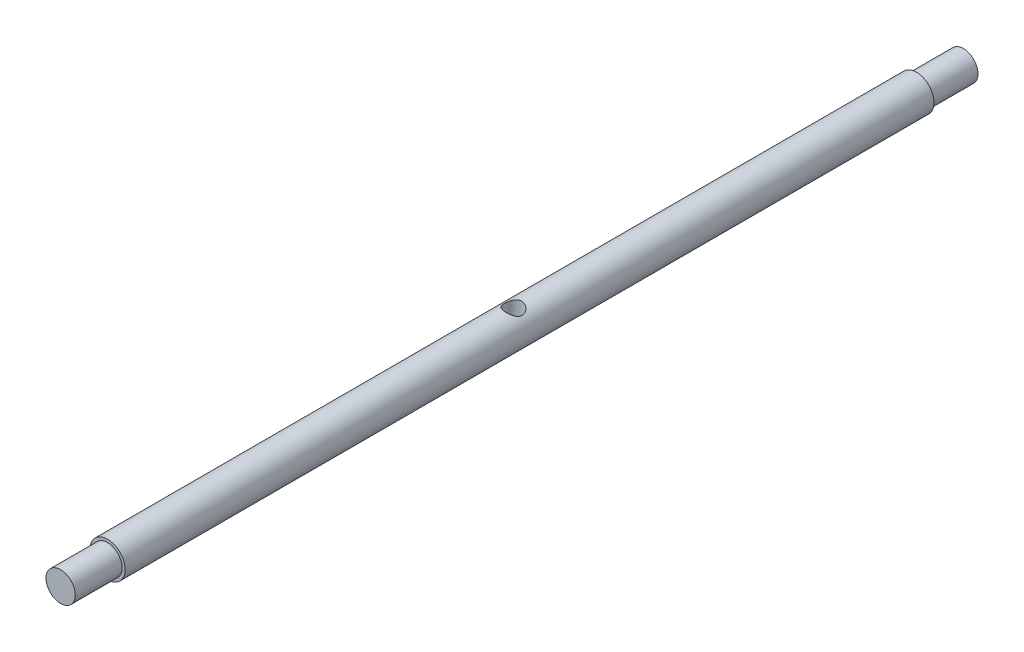
ISO-10303-21;
HEADER;
FILE_DESCRIPTION(('STEP AP214'),'2;1');
FILE_NAME('part.step','',(''),(''),'','','');
FILE_SCHEMA(('AUTOMOTIVE_DESIGN { 1 0 10303 214 1 1 1 1 }'));
ENDSEC;
DATA;
#1=APPLICATION_CONTEXT('core data for automotive mechanical design processes');
#2=APPLICATION_PROTOCOL_DEFINITION('international standard','automotive_design',2000,#1);
#3=PRODUCT_CONTEXT('',#1,'mechanical');
#4=PRODUCT('Part','Part','',(#3));
#5=PRODUCT_RELATED_PRODUCT_CATEGORY('part','',(#4));
#6=PRODUCT_DEFINITION_FORMATION('','',#4);
#7=PRODUCT_DEFINITION_CONTEXT('part definition',#1,'design');
#8=PRODUCT_DEFINITION('design','',#6,#7);
#9=PRODUCT_DEFINITION_SHAPE('','',#8);
#10=(LENGTH_UNIT() NAMED_UNIT(*) SI_UNIT(.MILLI.,.METRE.));
#11=(NAMED_UNIT(*) PLANE_ANGLE_UNIT() SI_UNIT($,.RADIAN.));
#12=(NAMED_UNIT(*) SI_UNIT($,.STERADIAN.) SOLID_ANGLE_UNIT());
#13=UNCERTAINTY_MEASURE_WITH_UNIT(LENGTH_MEASURE(1.E-05),#10,'distance_accuracy_value','');
#14=(GEOMETRIC_REPRESENTATION_CONTEXT(3) GLOBAL_UNCERTAINTY_ASSIGNED_CONTEXT((#13)) GLOBAL_UNIT_ASSIGNED_CONTEXT((#10,
#11,#12)) REPRESENTATION_CONTEXT('',''));
#15=CARTESIAN_POINT('',(0.,0.,0.));
#16=DIRECTION('',(0.,0.,1.));
#17=DIRECTION('',(1.,0.,0.));
#18=AXIS2_PLACEMENT_3D('',#15,#16,#17);
#19=CARTESIAN_POINT('',(0.,0.,138.));
#20=DIRECTION('',(0.,0.,-1.));
#21=DIRECTION('',(-1.,0.,0.));
#22=AXIS2_PLACEMENT_3D('',#19,#20,#21);
#23=CYLINDRICAL_SURFACE('',#22,3.);
#24=CARTESIAN_POINT('',(0.250000000000001,-2.98956518577535,70.5));
#25=CARTESIAN_POINT('',(0.172696421416141,-2.99602553013006,70.4999952113587));
#26=CARTESIAN_POINT('',(0.0950608738628828,-2.99947183506212,70.4939911977629));
#27=CARTESIAN_POINT('',(-0.0584400000249373,-3.00041641133484,70.4700060739507));
#28=CARTESIAN_POINT('',(-0.134302599700458,-2.99790606090529,70.4520076298905));
#29=CARTESIAN_POINT('',(-0.281790664814006,-2.98764875279408,70.4046990716207));
#30=CARTESIAN_POINT('',(-0.353427249171919,-2.9799162704619,70.37542032166));
#31=CARTESIAN_POINT('',(-0.49089667125681,-2.96037977583642,70.3065180067073));
#32=CARTESIAN_POINT('',(-0.556729410100019,-2.94857569418956,70.2668942655069));
#33=CARTESIAN_POINT('',(-0.68390290566241,-2.92175981715249,70.1765070165311));
#34=CARTESIAN_POINT('',(-0.744932006141061,-2.90663261458157,70.1253402270932));
#35=CARTESIAN_POINT('',(-0.858035984268783,-2.8752782830735,70.0141750538369));
#36=CARTESIAN_POINT('',(-0.910106018343036,-2.85905056572865,69.9541719251226));
#37=CARTESIAN_POINT('',(-1.00783823474594,-2.82614993688294,69.8216608362765));
#38=CARTESIAN_POINT('',(-1.05270403709698,-2.80953814266997,69.7485470746806));
#39=CARTESIAN_POINT('',(-1.12952233663047,-2.77954837023804,69.5952020399382));
#40=CARTESIAN_POINT('',(-1.16147822464401,-2.76616954324119,69.5149726424969));
#41=CARTESIAN_POINT('',(-1.21068231642024,-2.74498771769881,69.3514557226514));
#42=CARTESIAN_POINT('',(-1.22825565630192,-2.73706214215833,69.2682829052235));
#43=CARTESIAN_POINT('',(-1.24907437267902,-2.7276277771573,69.0998283727901));
#44=CARTESIAN_POINT('',(-1.25232969875111,-2.72611453180026,69.0145481636632));
#45=CARTESIAN_POINT('',(-1.2447045977589,-2.72960005759235,68.8519083751222));
#46=CARTESIAN_POINT('',(-1.23497697349754,-2.73406785294912,68.7744797801816));
#47=CARTESIAN_POINT('',(-1.20378978270818,-2.74794060264144,68.622486262657));
#48=CARTESIAN_POINT('',(-1.18232772499008,-2.75734660532886,68.547921951752));
#49=CARTESIAN_POINT('',(-1.12815486514093,-2.77995148574605,68.4027028080583));
#50=CARTESIAN_POINT('',(-1.09532481225703,-2.79319031849184,68.3320990318549));
#51=CARTESIAN_POINT('',(-1.01939794960569,-2.82178498312674,68.1971104043155));
#52=CARTESIAN_POINT('',(-0.976296911856051,-2.83714168572323,68.1327281293993));
#53=CARTESIAN_POINT('',(-0.876645912761246,-2.86957547362445,68.0061689998989));
#54=CARTESIAN_POINT('',(-0.819257803193823,-2.8866868853803,67.9446586786066));
#55=CARTESIAN_POINT('',(-0.694725375416323,-2.91915973110964,67.8318594221669));
#56=CARTESIAN_POINT('',(-0.627579181744113,-2.9345208276652,67.7805724564089));
#57=CARTESIAN_POINT('',(-0.484002949245949,-2.96161231613355,67.6890512104587));
#58=CARTESIAN_POINT('',(-0.407452021459475,-2.97328661594214,67.6489886455506));
#59=CARTESIAN_POINT('',(-0.248041133960001,-2.99079996604019,67.5824674072718));
#60=CARTESIAN_POINT('',(-0.16518598364012,-2.9966434174961,67.5559984806601));
#61=CARTESIAN_POINT('',(-0.00277248739777122,-3.00100907113583,67.5192999209167));
#62=CARTESIAN_POINT('',(0.0765154336064537,-3.00008206449229,67.5079358686385));
#63=CARTESIAN_POINT('',(0.235543527844702,-2.99179737422256,67.4979568907608));
#64=CARTESIAN_POINT('',(0.315283582667208,-2.98444130346059,67.4993387684109));
#65=CARTESIAN_POINT('',(0.468809965625174,-2.96410572172022,67.5141405994697));
#66=CARTESIAN_POINT('',(0.542695567092177,-2.9514227687626,67.5269609495946));
#67=CARTESIAN_POINT('',(0.686813726089403,-2.92125182634506,67.5630878149209));
#68=CARTESIAN_POINT('',(0.757045549245625,-2.90376287532967,67.5863964291472));
#69=CARTESIAN_POINT('',(0.896335445624112,-2.86393578112953,67.6441757942527));
#70=CARTESIAN_POINT('',(0.965095372126571,-2.84137710821006,67.6792098821918));
#71=CARTESIAN_POINT('',(1.09580389853578,-2.79357579351915,67.7588390109646));
#72=CARTESIAN_POINT('',(1.15774910097523,-2.76833182522363,67.8034387883658));
#73=CARTESIAN_POINT('',(1.28073937979296,-2.71380534340435,67.9069453045832));
#74=CARTESIAN_POINT('',(1.34083682600193,-2.68439520112317,67.966914002283));
#75=CARTESIAN_POINT('',(1.45039802141765,-2.6268201061624,68.0965316127875));
#76=CARTESIAN_POINT('',(1.49985070609688,-2.59865647306368,68.1661904752879));
#77=CARTESIAN_POINT('',(1.58865105160204,-2.54538491275337,68.3173425485545));
#78=CARTESIAN_POINT('',(1.62746875980633,-2.52046198169207,68.3992174575315));
#79=CARTESIAN_POINT('',(1.69004794562851,-2.47894626080137,68.5704428848147));
#80=CARTESIAN_POINT('',(1.71384470769536,-2.46233396835001,68.6597753216171));
#81=CARTESIAN_POINT('',(1.74235772318642,-2.44222225416342,68.8292944683731));
#82=CARTESIAN_POINT('',(1.74935466727669,-2.43716097073707,68.9089091849373));
#83=CARTESIAN_POINT('',(1.7505585690523,-2.43629851234424,69.0682744895491));
#84=CARTESIAN_POINT('',(1.74477159394935,-2.44049294464035,69.1480249952013));
#85=CARTESIAN_POINT('',(1.72245945671945,-2.45627310709654,69.294291490252));
#86=CARTESIAN_POINT('',(1.70745098558706,-2.46681119822039,69.3611658702209));
#87=CARTESIAN_POINT('',(1.66887874739995,-2.49306758410284,69.4913171316343));
#88=CARTESIAN_POINT('',(1.64531201334897,-2.5087876751933,69.5545927566452));
#89=CARTESIAN_POINT('',(1.58782565973683,-2.54559946080171,69.6823386299015));
#90=CARTESIAN_POINT('',(1.55313654939841,-2.56705903813716,69.7463537754109));
#91=CARTESIAN_POINT('',(1.47540709597103,-2.61250883856216,69.8681018728933));
#92=CARTESIAN_POINT('',(1.43236188557382,-2.6365005328387,69.9258311326879));
#93=CARTESIAN_POINT('',(1.33040732932635,-2.68958535448197,70.0439491556104));
#94=CARTESIAN_POINT('',(1.27003921802977,-2.71883295023781,70.1030166232692));
#95=CARTESIAN_POINT('',(1.13980707944065,-2.77595010505171,70.210527653715));
#96=CARTESIAN_POINT('',(1.06993446670592,-2.80381838676857,70.2589615065237));
#97=CARTESIAN_POINT('',(0.918383140458659,-2.8571538770292,70.3458277954573));
#98=CARTESIAN_POINT('',(0.836298835418432,-2.88244173980691,70.3836689017873));
#99=CARTESIAN_POINT('',(0.665254712903863,-2.92663196032698,70.4442085264027));
#100=CARTESIAN_POINT('',(0.576316164327065,-2.94555316541864,70.4669519367019));
#101=CARTESIAN_POINT('',(0.446784312400436,-2.96680680158529,70.4875563431324));
#102=CARTESIAN_POINT('',(0.407708195646954,-2.97243051578879,70.4922072442007));
#103=CARTESIAN_POINT('',(0.329117120645278,-2.98215498221843,70.4984304419079));
#104=CARTESIAN_POINT('',(0.289602122062034,-2.98625559325215,70.5000024531899));
#105=CARTESIAN_POINT('',(0.250000000000001,-2.98956518577535,70.5));
#106=B_SPLINE_CURVE_WITH_KNOTS('',3,(#24,#25,#26,#27,#28,#29,#30,#31,#32,#33,#34,#35,#36,#37,
#38,#39,#40,#41,#42,#43,#44,#45,#46,#47,#48,#49,#50,#51,#52,#53,#54,#55,#56,#57,#58,#59,#60,#61,
#62,#63,#64,#65,#66,#67,#68,#69,#70,#71,#72,#73,#74,#75,#76,#77,#78,#79,#80,#81,#82,#83,#84,#85,
#86,#87,#88,#89,#90,#91,#92,#93,#94,#95,#96,#97,#98,#99,#100,#101,#102,#103,#104,#105),
.UNSPECIFIED.,.T.,.F.,(4,2,2,2,2,2,2,2,2,2,2,2,2,2,2,2,2,2,2,2,2,2,2,2,2,2,2,2,2,2,2,2,2,2,2,2,
2,2,2,2,4),(0.,0.232563482252475,0.465463786363049,0.69772114410478,0.929982458196799,
1.17215711436666,1.41446228974798,1.67532828554851,1.93612571942891,2.19085060553646,
2.44539845552474,2.67878211225922,2.91221533499409,3.14817542976346,3.38423282422608,
3.64060352104624,3.89702355654567,4.15717534424428,4.417130618619,4.65618810668929,
4.89518563943392,5.12234626549699,5.34955237363677,5.58978476628075,5.83013638868452,
6.09852077395968,6.36718279420663,6.64747203003739,6.92710038738122,7.16585255100743,
7.40449142788037,7.61166075227993,7.81890196724106,8.04578374806323,8.2727980829704,
8.53978167468719,8.80700805505604,9.08705528583568,9.36626603941854,9.48539576277476,
9.60453652676078),.UNSPECIFIED.);
#107=CARTESIAN_POINT('',(0.250000000000001,-2.98956518577535,70.5));
#108=VERTEX_POINT('',#107);
#109=EDGE_CURVE('E56',#108,#108,#106,.T.);
#110=ORIENTED_EDGE('',*,*,#109,.F.);
#111=EDGE_LOOP('',(#110));
#112=FACE_BOUND('',#111,.T.);
#113=CARTESIAN_POINT('',(0.250000000000001,2.98956518577535,67.5));
#114=CARTESIAN_POINT('',(0.330738731939911,2.98280873811263,67.5000051662356));
#115=CARTESIAN_POINT('',(0.411273292725284,2.97274996540562,67.5065552512323));
#116=CARTESIAN_POINT('',(0.569364602132382,2.94657004716183,67.5321971590116));
#117=CARTESIAN_POINT('',(0.646916073100534,2.93043865687144,67.5513102169239));
#118=CARTESIAN_POINT('',(0.796593237901087,2.89332996682384,67.6009204263813));
#119=CARTESIAN_POINT('',(0.868742659202937,2.87237573475027,67.6313637995732));
#120=CARTESIAN_POINT('',(1.00658134407404,2.82702422335257,67.7024621840947));
#121=CARTESIAN_POINT('',(1.07227095362022,2.80262712859312,67.7431166481201));
#122=CARTESIAN_POINT('',(1.20120103979432,2.74997169234041,67.8372066612413));
#123=CARTESIAN_POINT('',(1.26382108021966,2.72156060827127,67.8914064831905));
#124=CARTESIAN_POINT('',(1.37942528956076,2.66483416649005,68.0094282026102));
#125=CARTESIAN_POINT('',(1.43239790902895,2.63651896282652,68.0732614678589));
#126=CARTESIAN_POINT('',(1.53120069682797,2.58048211432322,68.2148032164577));
#127=CARTESIAN_POINT('',(1.57617536367074,2.55297129204232,68.2931993416078));
#128=CARTESIAN_POINT('',(1.6517779151933,2.5047275467081,68.4584933708717));
#129=CARTESIAN_POINT('',(1.68243734716646,2.48397975036853,68.5453720652794));
#130=CARTESIAN_POINT('',(1.72174861813425,2.45682658701134,68.7021291054429));
#131=CARTESIAN_POINT('',(1.73401559820486,2.44811489530238,68.7707067672343));
#132=CARTESIAN_POINT('',(1.74888071332914,2.43752050568492,68.9094032296291));
#133=CARTESIAN_POINT('',(1.75148729222158,2.43563184402684,68.979520630438));
#134=CARTESIAN_POINT('',(1.74688577272881,2.43893335683976,69.119266842837));
#135=CARTESIAN_POINT('',(1.7396755968006,2.44412502973906,69.1888955478684));
#136=CARTESIAN_POINT('',(1.71585333459778,2.46090502069016,69.3257390265998));
#137=CARTESIAN_POINT('',(1.69923463680864,2.47249783678319,69.3929520674147));
#138=CARTESIAN_POINT('',(1.65694278227621,2.50103945031691,69.5247911771604));
#139=CARTESIAN_POINT('',(1.63109253895183,2.51809227237098,69.5893369505944));
#140=CARTESIAN_POINT('',(1.57129421057681,2.55583314179351,69.7133932059918));
#141=CARTESIAN_POINT('',(1.53734288927565,2.57652264108405,69.7729016627242));
#142=CARTESIAN_POINT('',(1.45567270494108,2.62366110115278,69.8959326147669));
#143=CARTESIAN_POINT('',(1.40659318649113,2.65049044505074,69.9584076190438));
#144=CARTESIAN_POINT('',(1.2993393146912,2.70468735899782,70.0747824386444));
#145=CARTESIAN_POINT('',(1.2411573484079,2.73205536265853,70.1286749991158));
#146=CARTESIAN_POINT('',(1.10913117162797,2.78847062300487,70.2327907777924));
#147=CARTESIAN_POINT('',(1.03424662886943,2.81732896954533,70.2818101375814));
#148=CARTESIAN_POINT('',(0.875688959705415,2.87056572531939,70.3662234058533));
#149=CARTESIAN_POINT('',(0.792019766041936,2.89494612592806,70.4016233786808));
#150=CARTESIAN_POINT('',(0.622891488127752,2.9358386339939,70.4554666168759));
#151=CARTESIAN_POINT('',(0.537785897806955,2.9527106651175,70.4747377297906));
#152=CARTESIAN_POINT('',(0.364426251595441,2.9790692771816,70.4981775772863));
#153=CARTESIAN_POINT('',(0.276175278819289,2.98856289297778,70.5023607111999));
#154=CARTESIAN_POINT('',(0.110050078028687,2.99900165819639,70.4954979466091));
#155=CARTESIAN_POINT('',(0.0321543832226181,3.00080735406335,70.4861548512244));
#156=CARTESIAN_POINT('',(-0.121135062623037,2.99853281299341,70.4554606504516));
#157=CARTESIAN_POINT('',(-0.196528994304638,2.99445300197495,70.4341104140565));
#158=CARTESIAN_POINT('',(-0.340873315112753,2.98143199574489,70.3808140615142));
#159=CARTESIAN_POINT('',(-0.409936381649041,2.97261247461647,70.3491406388397));
#160=CARTESIAN_POINT('',(-0.542083610199264,2.95137756068305,70.2760522960405));
#161=CARTESIAN_POINT('',(-0.605166244441462,2.9389612523043,70.23463489606));
#162=CARTESIAN_POINT('',(-0.72842252430682,2.91095845299777,70.1398085132658));
#163=CARTESIAN_POINT('',(-0.788059430869043,2.89520804378707,70.0857507078724));
#164=CARTESIAN_POINT('',(-0.897894922907593,2.86305192996224,69.9689034161992));
#165=CARTESIAN_POINT('',(-0.948088011807053,2.84664585042185,69.9061088816428));
#166=CARTESIAN_POINT('',(-1.04102388370385,2.8140471270346,69.7685109503411));
#167=CARTESIAN_POINT('',(-1.08302247455213,2.79794579779126,69.6931799927849));
#168=CARTESIAN_POINT('',(-1.15367768237463,2.76956463315532,69.5358327242646));
#169=CARTESIAN_POINT('',(-1.18234049832159,2.75728302309472,69.4538195403278));
#170=CARTESIAN_POINT('',(-1.22434879969598,2.73888353519597,69.2885875442407));
#171=CARTESIAN_POINT('',(-1.23822955223249,2.73255132087997,69.2055299310377));
#172=CARTESIAN_POINT('',(-1.25186610280975,2.72633351220779,69.0380434316594));
#173=CARTESIAN_POINT('',(-1.25162976303293,2.72644432955577,68.9536153349364));
#174=CARTESIAN_POINT('',(-1.23764609710901,2.73281458905837,68.7928654503927));
#175=CARTESIAN_POINT('',(-1.22496239496645,2.73858997348171,68.7164281765176));
#176=CARTESIAN_POINT('',(-1.18816946486267,2.75475096239939,68.5668691175421));
#177=CARTESIAN_POINT('',(-1.16405742360209,2.76513770202518,68.4937481536725));
#178=CARTESIAN_POINT('',(-1.10444840068184,2.78948935033096,68.3506655602011));
#179=CARTESIAN_POINT('',(-1.06867040861751,2.80354066026259,68.2808363990064));
#180=CARTESIAN_POINT('',(-0.986898302713409,2.83335895481494,68.1478365931592));
#181=CARTESIAN_POINT('',(-0.940899999200066,2.84912664168433,68.0846686949031));
#182=CARTESIAN_POINT('',(-0.835355749465309,2.88192342599577,67.9611811177354));
#183=CARTESIAN_POINT('',(-0.774992466602813,2.89894628349529,67.9015554957815));
#184=CARTESIAN_POINT('',(-0.644685058842929,2.93067769450241,67.7930512196244));
#185=CARTESIAN_POINT('',(-0.574737960002653,2.94538552658104,67.7441759136528));
#186=CARTESIAN_POINT('',(-0.426930293285224,2.97041202822187,67.6587117558716));
#187=CARTESIAN_POINT('',(-0.349067811586598,2.98072963315061,67.6221258847118));
#188=CARTESIAN_POINT('',(-0.187801808480495,2.99520302769709,67.5627539557));
#189=CARTESIAN_POINT('',(-0.104410510885682,2.9993719661473,67.5399385119448));
#190=CARTESIAN_POINT('',(0.0247816311580124,3.00023114010758,67.5163096582267));
#191=CARTESIAN_POINT('',(0.0696638823083744,2.99952965823438,67.5101933628879));
#192=CARTESIAN_POINT('',(0.159718676698941,2.99608404194845,67.5020372014414));
#193=CARTESIAN_POINT('',(0.204891204016308,2.99334001864514,67.4999971136199));
#194=CARTESIAN_POINT('',(0.250000000000001,2.98956518577535,67.5));
#195=B_SPLINE_CURVE_WITH_KNOTS('',3,(#113,#114,#115,#116,#117,#118,#119,#120,#121,#122,#123,
#124,#125,#126,#127,#128,#129,#130,#131,#132,#133,#134,#135,#136,#137,#138,#139,#140,#141,#142,
#143,#144,#145,#146,#147,#148,#149,#150,#151,#152,#153,#154,#155,#156,#157,#158,#159,#160,#161,
#162,#163,#164,#165,#166,#167,#168,#169,#170,#171,#172,#173,#174,#175,#176,#177,#178,#179,#180,
#181,#182,#183,#184,#185,#186,#187,#188,#189,#190,#191,#192,#193,#194),.UNSPECIFIED.,.T.,.F.,(4,
2,2,2,2,2,2,2,2,2,2,2,2,2,2,2,2,2,2,2,2,2,2,2,2,2,2,2,2,2,2,2,2,2,2,2,2,2,2,2,4),(0.,
0.242877973701601,0.486167542199706,0.728316786585039,0.970453054782749,1.23203655913491,
1.49393118970864,1.77584521095731,2.05713499536854,2.26683531092134,2.47635229104264,
2.68591361862993,2.8956223913321,3.10959149213281,3.32364621368354,3.57422301276414,
3.8250105160754,4.10570301491016,4.38627038391231,4.65135683207307,4.91619022583505,
5.15044178851437,5.38467639988306,5.61316665133948,5.84171511691008,6.08672424544619,
6.33187553825886,6.59379106702209,6.85558472560084,7.10753777046699,7.35935049732122,
7.59136701951385,7.82344068659959,8.06157809609161,8.29981330738313,8.55822072067228,
8.81670850244191,9.07525893202203,9.33325564957963,9.46895915478713,9.60465527858546),.UNSPECIFIED.);
#196=CARTESIAN_POINT('',(0.250000000000001,2.98956518577535,67.5));
#197=VERTEX_POINT('',#196);
#198=EDGE_CURVE('E63',#197,#197,#195,.T.);
#199=ORIENTED_EDGE('',*,*,#198,.T.);
#200=EDGE_LOOP('',(#199));
#201=FACE_BOUND('',#200,.T.);
#202=CARTESIAN_POINT('',(0.,0.,138.));
#203=DIRECTION('',(0.,0.,1.));
#204=DIRECTION('',(1.,0.,0.));
#205=AXIS2_PLACEMENT_3D('',#202,#203,#204);
#206=CIRCLE('',#205,3.);
#207=CARTESIAN_POINT('',(3.,0.,138.));
#208=VERTEX_POINT('',#207);
#209=EDGE_CURVE('E37',#208,#208,#206,.T.);
#210=ORIENTED_EDGE('',*,*,#209,.F.);
#211=EDGE_LOOP('',(#210));
#212=FACE_BOUND('',#211,.T.);
#213=CARTESIAN_POINT('',(0.,0.,0.));
#214=DIRECTION('',(0.,0.,1.));
#215=DIRECTION('',(1.,0.,0.));
#216=AXIS2_PLACEMENT_3D('',#213,#214,#215);
#217=CIRCLE('',#216,3.);
#218=CARTESIAN_POINT('',(3.,0.,0.));
#219=VERTEX_POINT('',#218);
#220=EDGE_CURVE('E41',#219,#219,#217,.T.);
#221=ORIENTED_EDGE('',*,*,#220,.T.);
#222=EDGE_LOOP('',(#221));
#223=FACE_BOUND('',#222,.T.);
#224=ADVANCED_FACE('F31',(#112,#201,#212,#223),#23,.T.);
#225=CARTESIAN_POINT('',(0.,0.,138.));
#226=DIRECTION('',(0.,0.,1.));
#227=DIRECTION('',(1.,0.,0.));
#228=AXIS2_PLACEMENT_3D('',#225,#226,#227);
#229=PLANE('',#228);
#230=CARTESIAN_POINT('',(0.,0.,138.));
#231=DIRECTION('',(0.,0.,1.));
#232=DIRECTION('',(1.,0.,0.));
#233=AXIS2_PLACEMENT_3D('',#230,#231,#232);
#234=CIRCLE('',#233,2.5);
#235=CARTESIAN_POINT('',(2.5,0.,138.));
#236=VERTEX_POINT('',#235);
#237=EDGE_CURVE('E48',#236,#236,#234,.T.);
#238=ORIENTED_EDGE('',*,*,#237,.F.);
#239=EDGE_LOOP('',(#238));
#240=FACE_BOUND('',#239,.T.);
#241=ORIENTED_EDGE('',*,*,#209,.T.);
#242=EDGE_LOOP('',(#241));
#243=FACE_BOUND('',#242,.T.);
#244=ADVANCED_FACE('F89',(#240,#243),#229,.T.);
#245=CARTESIAN_POINT('',(0.,0.,0.));
#246=DIRECTION('',(0.,0.,1.));
#247=DIRECTION('',(1.,0.,0.));
#248=AXIS2_PLACEMENT_3D('',#245,#246,#247);
#249=PLANE('',#248);
#250=CARTESIAN_POINT('',(0.,0.,0.));
#251=DIRECTION('',(0.,0.,1.));
#252=DIRECTION('',(1.,0.,0.));
#253=AXIS2_PLACEMENT_3D('',#250,#251,#252);
#254=CIRCLE('',#253,2.5);
#255=CARTESIAN_POINT('',(2.5,0.,0.));
#256=VERTEX_POINT('',#255);
#257=EDGE_CURVE('E10',#256,#256,#254,.F.);
#258=ORIENTED_EDGE('',*,*,#257,.F.);
#259=EDGE_LOOP('',(#258));
#260=FACE_BOUND('',#259,.T.);
#261=ORIENTED_EDGE('',*,*,#220,.F.);
#262=EDGE_LOOP('',(#261));
#263=FACE_BOUND('',#262,.T.);
#264=ADVANCED_FACE('F87',(#260,#263),#249,.F.);
#265=CARTESIAN_POINT('',(0.,0.,146.));
#266=DIRECTION('',(0.,0.,-1.));
#267=DIRECTION('',(-1.,0.,0.));
#268=AXIS2_PLACEMENT_3D('',#265,#266,#267);
#269=CYLINDRICAL_SURFACE('',#268,2.5);
#270=CARTESIAN_POINT('',(0.,0.,146.));
#271=DIRECTION('',(0.,0.,1.));
#272=DIRECTION('',(1.,0.,0.));
#273=AXIS2_PLACEMENT_3D('',#270,#271,#272);
#274=CIRCLE('',#273,2.5);
#275=CARTESIAN_POINT('',(2.5,0.,146.));
#276=VERTEX_POINT('',#275);
#277=EDGE_CURVE('E46',#276,#276,#274,.T.);
#278=ORIENTED_EDGE('',*,*,#277,.F.);
#279=EDGE_LOOP('',(#278));
#280=FACE_BOUND('',#279,.T.);
#281=ORIENTED_EDGE('',*,*,#237,.T.);
#282=EDGE_LOOP('',(#281));
#283=FACE_BOUND('',#282,.T.);
#284=ADVANCED_FACE('F83',(#280,#283),#269,.T.);
#285=CARTESIAN_POINT('',(0.,0.,146.));
#286=DIRECTION('',(0.,0.,1.));
#287=DIRECTION('',(1.,0.,0.));
#288=AXIS2_PLACEMENT_3D('',#285,#286,#287);
#289=PLANE('',#288);
#290=ORIENTED_EDGE('',*,*,#277,.T.);
#291=EDGE_LOOP('',(#290));
#292=FACE_BOUND('',#291,.T.);
#293=ADVANCED_FACE('F79',(#292),#289,.T.);
#294=CARTESIAN_POINT('',(0.,0.,-8.));
#295=DIRECTION('',(0.,0.,1.));
#296=DIRECTION('',(1.,0.,0.));
#297=AXIS2_PLACEMENT_3D('',#294,#295,#296);
#298=CYLINDRICAL_SURFACE('',#297,2.5);
#299=CARTESIAN_POINT('',(0.,0.,-8.));
#300=DIRECTION('',(0.,0.,-1.));
#301=DIRECTION('',(-1.,0.,0.));
#302=AXIS2_PLACEMENT_3D('',#299,#300,#301);
#303=CIRCLE('',#302,2.5);
#304=CARTESIAN_POINT('',(-2.5,0.,-8.));
#305=VERTEX_POINT('',#304);
#306=EDGE_CURVE('E51',#305,#305,#303,.T.);
#307=ORIENTED_EDGE('',*,*,#306,.F.);
#308=EDGE_LOOP('',(#307));
#309=FACE_BOUND('',#308,.T.);
#310=ORIENTED_EDGE('',*,*,#257,.T.);
#311=EDGE_LOOP('',(#310));
#312=FACE_BOUND('',#311,.T.);
#313=ADVANCED_FACE('F75',(#309,#312),#298,.T.);
#314=CARTESIAN_POINT('',(0.,0.,-8.));
#315=DIRECTION('',(0.,0.,-1.));
#316=DIRECTION('',(-1.,0.,0.));
#317=AXIS2_PLACEMENT_3D('',#314,#315,#316);
#318=PLANE('',#317);
#319=ORIENTED_EDGE('',*,*,#306,.T.);
#320=EDGE_LOOP('',(#319));
#321=FACE_BOUND('',#320,.T.);
#322=ADVANCED_FACE('F72',(#321),#318,.T.);
#323=CARTESIAN_POINT('',(0.250000000000001,-3.001,69.));
#324=DIRECTION('',(0.,1.,0.));
#325=DIRECTION('',(0.,0.,1.));
#326=AXIS2_PLACEMENT_3D('',#323,#324,#325);
#327=CYLINDRICAL_SURFACE('',#326,1.5);
#328=ORIENTED_EDGE('',*,*,#109,.T.);
#329=EDGE_LOOP('',(#328));
#330=FACE_BOUND('',#329,.T.);
#331=ORIENTED_EDGE('',*,*,#198,.F.);
#332=EDGE_LOOP('',(#331));
#333=FACE_BOUND('',#332,.T.);
#334=ADVANCED_FACE('F68',(#330,#333),#327,.F.);
#335=CLOSED_SHELL('',(#224,#244,#264,#284,#293,#313,#322,#334));
#336=MANIFOLD_SOLID_BREP('B2',#335);
#337=ADVANCED_BREP_SHAPE_REPRESENTATION('',(#18,#336),#14);
#338=SHAPE_DEFINITION_REPRESENTATION(#9,#337);
ENDSEC;
END-ISO-10303-21;
